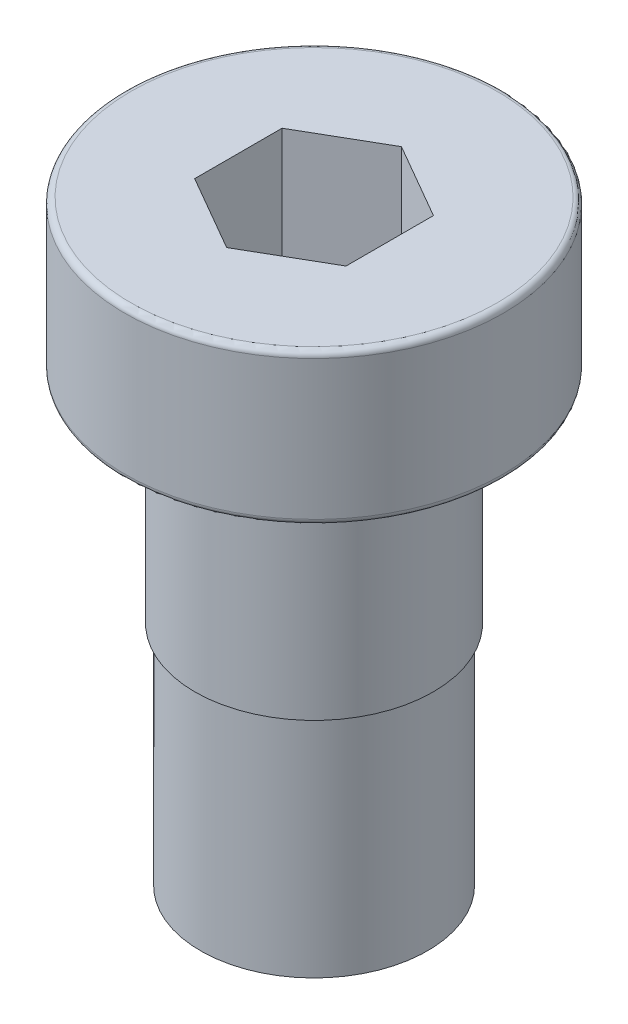
ISO-10303-21;
HEADER;
FILE_DESCRIPTION(('STEP AP214'),'2;1');
FILE_NAME('part.step','',(''),(''),'','','');
FILE_SCHEMA(('AUTOMOTIVE_DESIGN { 1 0 10303 214 1 1 1 1 }'));
ENDSEC;
DATA;
#1=APPLICATION_CONTEXT('core data for automotive mechanical design processes');
#2=APPLICATION_PROTOCOL_DEFINITION('international standard','automotive_design',2000,#1);
#3=PRODUCT_CONTEXT('',#1,'mechanical');
#4=PRODUCT('Part','Part','',(#3));
#5=PRODUCT_RELATED_PRODUCT_CATEGORY('part','',(#4));
#6=PRODUCT_DEFINITION_FORMATION('','',#4);
#7=PRODUCT_DEFINITION_CONTEXT('part definition',#1,'design');
#8=PRODUCT_DEFINITION('design','',#6,#7);
#9=PRODUCT_DEFINITION_SHAPE('','',#8);
#10=(LENGTH_UNIT() NAMED_UNIT(*) SI_UNIT(.MILLI.,.METRE.));
#11=(NAMED_UNIT(*) PLANE_ANGLE_UNIT() SI_UNIT($,.RADIAN.));
#12=(NAMED_UNIT(*) SI_UNIT($,.STERADIAN.) SOLID_ANGLE_UNIT());
#13=UNCERTAINTY_MEASURE_WITH_UNIT(LENGTH_MEASURE(1.E-05),#10,'distance_accuracy_value','');
#14=(GEOMETRIC_REPRESENTATION_CONTEXT(3) GLOBAL_UNCERTAINTY_ASSIGNED_CONTEXT((#13)) GLOBAL_UNIT_ASSIGNED_CONTEXT((#10,
#11,#12)) REPRESENTATION_CONTEXT('',''));
#15=CARTESIAN_POINT('',(0.,0.,0.));
#16=DIRECTION('',(0.,0.,1.));
#17=DIRECTION('',(1.,0.,0.));
#18=AXIS2_PLACEMENT_3D('',#15,#16,#17);
#19=CARTESIAN_POINT('',(0.,-16.6788453947775,0.));
#20=DIRECTION('',(0.,1.,0.));
#21=DIRECTION('',(-1.,0.,0.));
#22=AXIS2_PLACEMENT_3D('',#19,#20,#21);
#23=CYLINDRICAL_SURFACE('',#22,4.7625);
#24=CARTESIAN_POINT('',(0.,-4.56311,0.));
#25=DIRECTION('',(0.,1.,0.));
#26=DIRECTION('',(-1.,0.,0.));
#27=AXIS2_PLACEMENT_3D('',#24,#25,#26);
#28=CIRCLE('',#27,4.7625);
#29=CARTESIAN_POINT('',(-4.76249999999999,-4.56311,0.));
#30=VERTEX_POINT('',#29);
#31=EDGE_CURVE('E148',#30,#30,#28,.T.);
#32=ORIENTED_EDGE('',*,*,#31,.F.);
#33=EDGE_LOOP('',(#32));
#34=FACE_BOUND('',#33,.T.);
#35=CARTESIAN_POINT('',(0.,-14.08811,0.));
#36=DIRECTION('',(0.,1.,0.));
#37=DIRECTION('',(-1.,0.,0.));
#38=AXIS2_PLACEMENT_3D('',#35,#36,#37);
#39=CIRCLE('',#38,4.7625);
#40=CARTESIAN_POINT('',(-4.7625,-14.08811,0.));
#41=VERTEX_POINT('',#40);
#42=EDGE_CURVE('E137',#41,#41,#39,.T.);
#43=ORIENTED_EDGE('',*,*,#42,.T.);
#44=EDGE_LOOP('',(#43));
#45=FACE_BOUND('',#44,.T.);
#46=ADVANCED_FACE('F35',(#34,#45),#23,.T.);
#47=CARTESIAN_POINT('',(0.,-4.56311,0.));
#48=DIRECTION('',(0.,-1.,0.));
#49=DIRECTION('',(1.,0.,0.));
#50=AXIS2_PLACEMENT_3D('',#47,#48,#49);
#51=PLANE('',#50);
#52=ORIENTED_EDGE('',*,*,#31,.T.);
#53=EDGE_LOOP('',(#52));
#54=FACE_BOUND('',#53,.T.);
#55=CARTESIAN_POINT('',(0.,-4.56311,0.));
#56=DIRECTION('',(0.,1.,0.));
#57=DIRECTION('',(-1.,0.,0.));
#58=AXIS2_PLACEMENT_3D('',#55,#56,#57);
#59=CIRCLE('',#58,5.);
#60=CARTESIAN_POINT('',(-4.99999999999999,-4.56311,0.));
#61=VERTEX_POINT('',#60);
#62=EDGE_CURVE('E145',#61,#61,#59,.T.);
#63=ORIENTED_EDGE('',*,*,#62,.F.);
#64=EDGE_LOOP('',(#63));
#65=FACE_BOUND('',#64,.T.);
#66=ADVANCED_FACE('F198',(#54,#65),#51,.T.);
#67=CARTESIAN_POINT('',(0.,-16.6788453947775,0.));
#68=DIRECTION('',(0.,1.,0.));
#69=DIRECTION('',(-1.,0.,0.));
#70=AXIS2_PLACEMENT_3D('',#67,#68,#69);
#71=CYLINDRICAL_SURFACE('',#70,5.);
#72=CARTESIAN_POINT('',(0.,4.30911,0.));
#73=DIRECTION('',(0.,-1.,0.));
#74=DIRECTION('',(1.,0.,0.));
#75=AXIS2_PLACEMENT_3D('',#72,#73,#74);
#76=CIRCLE('',#75,5.);
#77=CARTESIAN_POINT('',(5.,4.30911,0.));
#78=VERTEX_POINT('',#77);
#79=EDGE_CURVE('E154',#78,#78,#76,.T.);
#80=ORIENTED_EDGE('',*,*,#79,.T.);
#81=EDGE_LOOP('',(#80));
#82=FACE_BOUND('',#81,.T.);
#83=ORIENTED_EDGE('',*,*,#62,.T.);
#84=EDGE_LOOP('',(#83));
#85=FACE_BOUND('',#84,.T.);
#86=ADVANCED_FACE('F204',(#82,#85),#71,.T.);
#87=CARTESIAN_POINT('',(0.,4.56311,0.));
#88=DIRECTION('',(0.,-1.,0.));
#89=DIRECTION('',(1.,0.,0.));
#90=AXIS2_PLACEMENT_3D('',#87,#88,#89);
#91=PLANE('',#90);
#92=CARTESIAN_POINT('',(0.,4.56311,0.));
#93=DIRECTION('',(0.,-1.,0.));
#94=DIRECTION('',(1.,0.,0.));
#95=AXIS2_PLACEMENT_3D('',#92,#93,#94);
#96=CIRCLE('',#95,7.68349999999999);
#97=CARTESIAN_POINT('',(7.6835,4.56311,0.));
#98=VERTEX_POINT('',#97);
#99=EDGE_CURVE('E11',#98,#98,#96,.T.);
#100=ORIENTED_EDGE('',*,*,#99,.T.);
#101=EDGE_LOOP('',(#100));
#102=FACE_BOUND('',#101,.T.);
#103=CARTESIAN_POINT('',(0.,4.56311,0.));
#104=DIRECTION('',(0.,-1.,0.));
#105=DIRECTION('',(1.,0.,0.));
#106=AXIS2_PLACEMENT_3D('',#103,#104,#105);
#107=CIRCLE('',#106,5.254);
#108=CARTESIAN_POINT('',(5.254,4.56311,0.));
#109=VERTEX_POINT('',#108);
#110=EDGE_CURVE('E151',#109,#109,#107,.F.);
#111=ORIENTED_EDGE('',*,*,#110,.T.);
#112=EDGE_LOOP('',(#111));
#113=FACE_BOUND('',#112,.T.);
#114=ADVANCED_FACE('F221',(#102,#113),#91,.T.);
#115=CARTESIAN_POINT('',(0.,-16.6788453947775,0.));
#116=DIRECTION('',(0.,1.,0.));
#117=DIRECTION('',(-1.,0.,0.));
#118=AXIS2_PLACEMENT_3D('',#115,#116,#117);
#119=CYLINDRICAL_SURFACE('',#118,7.93749999999999);
#120=CARTESIAN_POINT('',(0.,10.65911,0.));
#121=DIRECTION('',(0.,-1.,0.));
#122=DIRECTION('',(1.,0.,0.));
#123=AXIS2_PLACEMENT_3D('',#120,#121,#122);
#124=CIRCLE('',#123,7.93749999999999);
#125=CARTESIAN_POINT('',(7.9375,10.65911,0.));
#126=VERTEX_POINT('',#125);
#127=EDGE_CURVE('E43',#126,#126,#124,.T.);
#128=ORIENTED_EDGE('',*,*,#127,.T.);
#129=EDGE_LOOP('',(#128));
#130=FACE_BOUND('',#129,.T.);
#131=CARTESIAN_POINT('',(0.,4.81711,0.));
#132=DIRECTION('',(0.,-1.,0.));
#133=DIRECTION('',(1.,0.,0.));
#134=AXIS2_PLACEMENT_3D('',#131,#132,#133);
#135=CIRCLE('',#134,7.93749999999999);
#136=CARTESIAN_POINT('',(7.9375,4.81710999999999,0.));
#137=VERTEX_POINT('',#136);
#138=EDGE_CURVE('E160',#137,#137,#135,.F.);
#139=ORIENTED_EDGE('',*,*,#138,.T.);
#140=EDGE_LOOP('',(#139));
#141=FACE_BOUND('',#140,.T.);
#142=ADVANCED_FACE('F165',(#130,#141),#119,.T.);
#143=CARTESIAN_POINT('',(0.,10.91311,0.));
#144=DIRECTION('',(0.,-1.,0.));
#145=DIRECTION('',(1.,0.,0.));
#146=AXIS2_PLACEMENT_3D('',#143,#144,#145);
#147=PLANE('',#146);
#148=CARTESIAN_POINT('',(0.,10.91311,0.));
#149=DIRECTION('',(0.,-1.,0.));
#150=DIRECTION('',(1.,0.,0.));
#151=AXIS2_PLACEMENT_3D('',#148,#149,#150);
#152=CIRCLE('',#151,7.68349999999999);
#153=CARTESIAN_POINT('',(7.6835,10.91311,0.));
#154=VERTEX_POINT('',#153);
#155=EDGE_CURVE('E157',#154,#154,#152,.F.);
#156=ORIENTED_EDGE('',*,*,#155,.T.);
#157=EDGE_LOOP('',(#156));
#158=FACE_BOUND('',#157,.T.);
#159=DIRECTION('',(-0.866025403784439,0.,0.5));
#160=VECTOR('',#159,1.);
#161=CARTESIAN_POINT('',(0.,10.91311,-3.66617420935412));
#162=LINE('',#161,#160);
#163=CARTESIAN_POINT('',(0.,10.91311,-3.66617420935412));
#164=VERTEX_POINT('',#163);
#165=CARTESIAN_POINT('',(-3.175,10.91311,-1.83308710467706));
#166=VERTEX_POINT('',#165);
#167=EDGE_CURVE('E124',#164,#166,#162,.T.);
#168=ORIENTED_EDGE('',*,*,#167,.F.);
#169=DIRECTION('',(-0.866025403784439,0.,-0.5));
#170=VECTOR('',#169,1.);
#171=CARTESIAN_POINT('',(3.175,10.91311,-1.83308710467706));
#172=LINE('',#171,#170);
#173=CARTESIAN_POINT('',(3.175,10.91311,-1.83308710467706));
#174=VERTEX_POINT('',#173);
#175=EDGE_CURVE('E50',#174,#164,#172,.T.);
#176=ORIENTED_EDGE('',*,*,#175,.F.);
#177=DIRECTION('',(0.,0.,-1.));
#178=VECTOR('',#177,1.);
#179=CARTESIAN_POINT('',(3.175,10.91311,1.83308710467706));
#180=LINE('',#179,#178);
#181=CARTESIAN_POINT('',(3.175,10.91311,1.83308710467706));
#182=VERTEX_POINT('',#181);
#183=EDGE_CURVE('E133',#182,#174,#180,.T.);
#184=ORIENTED_EDGE('',*,*,#183,.F.);
#185=DIRECTION('',(0.866025403784439,0.,-0.5));
#186=VECTOR('',#185,1.);
#187=CARTESIAN_POINT('',(0.,10.91311,3.66617420935412));
#188=LINE('',#187,#186);
#189=CARTESIAN_POINT('',(0.,10.91311,3.66617420935412));
#190=VERTEX_POINT('',#189);
#191=EDGE_CURVE('E131',#190,#182,#188,.T.);
#192=ORIENTED_EDGE('',*,*,#191,.F.);
#193=DIRECTION('',(0.866025403784438,0.,0.5));
#194=VECTOR('',#193,1.);
#195=CARTESIAN_POINT('',(-3.175,10.91311,1.83308710467706));
#196=LINE('',#195,#194);
#197=CARTESIAN_POINT('',(-3.175,10.91311,1.83308710467706));
#198=VERTEX_POINT('',#197);
#199=EDGE_CURVE('E98',#198,#190,#196,.T.);
#200=ORIENTED_EDGE('',*,*,#199,.F.);
#201=DIRECTION('',(0.,0.,1.));
#202=VECTOR('',#201,1.);
#203=CARTESIAN_POINT('',(-3.175,10.91311,-1.83308710467706));
#204=LINE('',#203,#202);
#205=EDGE_CURVE('E127',#166,#198,#204,.T.);
#206=ORIENTED_EDGE('',*,*,#205,.F.);
#207=EDGE_LOOP('',(#168,#176,#184,#192,#200,#206));
#208=FACE_BOUND('',#207,.T.);
#209=ADVANCED_FACE('F174',(#158,#208),#147,.F.);
#210=CARTESIAN_POINT('',(0.,-14.08811,0.));
#211=DIRECTION('',(0.,1.,0.));
#212=DIRECTION('',(-1.,0.,0.));
#213=AXIS2_PLACEMENT_3D('',#210,#211,#212);
#214=PLANE('',#213);
#215=ORIENTED_EDGE('',*,*,#42,.F.);
#216=EDGE_LOOP('',(#215));
#217=FACE_BOUND('',#216,.T.);
#218=ADVANCED_FACE('F177',(#217),#214,.F.);
#219=CARTESIAN_POINT('',(3.175,4.56311000000001,-1.83308710467706));
#220=DIRECTION('',(0.5,0.,-0.866025403784439));
#221=DIRECTION('',(-0.866025403784439,0.,-0.5));
#222=AXIS2_PLACEMENT_3D('',#219,#220,#221);
#223=PLANE('',#222);
#224=ORIENTED_EDGE('',*,*,#175,.T.);
#225=DIRECTION('',(0.,1.,0.));
#226=VECTOR('',#225,1.);
#227=CARTESIAN_POINT('',(0.,4.56311000000001,-3.66617420935412));
#228=LINE('',#227,#226);
#229=CARTESIAN_POINT('',(0.,4.56311000000001,-3.66617420935412));
#230=VERTEX_POINT('',#229);
#231=EDGE_CURVE('E80',#230,#164,#228,.T.);
#232=ORIENTED_EDGE('',*,*,#231,.F.);
#233=DIRECTION('',(-0.866025403784439,0.,-0.5));
#234=VECTOR('',#233,1.);
#235=CARTESIAN_POINT('',(3.175,4.56311000000001,-1.83308710467706));
#236=LINE('',#235,#234);
#237=CARTESIAN_POINT('',(3.175,4.56311000000001,-1.83308710467706));
#238=VERTEX_POINT('',#237);
#239=EDGE_CURVE('E135',#238,#230,#236,.T.);
#240=ORIENTED_EDGE('',*,*,#239,.F.);
#241=DIRECTION('',(0.,1.,0.));
#242=VECTOR('',#241,1.);
#243=CARTESIAN_POINT('',(3.175,4.56311000000001,-1.83308710467706));
#244=LINE('',#243,#242);
#245=EDGE_CURVE('E58',#238,#174,#244,.T.);
#246=ORIENTED_EDGE('',*,*,#245,.T.);
#247=EDGE_LOOP('',(#224,#232,#240,#246));
#248=FACE_BOUND('',#247,.T.);
#249=ADVANCED_FACE('F185',(#248),#223,.F.);
#250=CARTESIAN_POINT('',(3.175,4.56311000000001,1.83308710467706));
#251=DIRECTION('',(1.,0.,0.));
#252=DIRECTION('',(0.,1.,0.));
#253=AXIS2_PLACEMENT_3D('',#250,#251,#252);
#254=PLANE('',#253);
#255=ORIENTED_EDGE('',*,*,#183,.T.);
#256=ORIENTED_EDGE('',*,*,#245,.F.);
#257=DIRECTION('',(0.,0.,-1.));
#258=VECTOR('',#257,1.);
#259=CARTESIAN_POINT('',(3.175,4.56311000000001,1.83308710467706));
#260=LINE('',#259,#258);
#261=CARTESIAN_POINT('',(3.175,4.56311000000001,1.83308710467706));
#262=VERTEX_POINT('',#261);
#263=EDGE_CURVE('E110',#262,#238,#260,.T.);
#264=ORIENTED_EDGE('',*,*,#263,.F.);
#265=DIRECTION('',(0.,1.,0.));
#266=VECTOR('',#265,1.);
#267=CARTESIAN_POINT('',(3.175,4.56311000000001,1.83308710467706));
#268=LINE('',#267,#266);
#269=EDGE_CURVE('E102',#262,#182,#268,.T.);
#270=ORIENTED_EDGE('',*,*,#269,.T.);
#271=EDGE_LOOP('',(#255,#256,#264,#270));
#272=FACE_BOUND('',#271,.T.);
#273=ADVANCED_FACE('F187',(#272),#254,.F.);
#274=CARTESIAN_POINT('',(0.,4.56311000000001,3.66617420935412));
#275=DIRECTION('',(0.5,0.,0.866025403784439));
#276=DIRECTION('',(0.866025403784439,0.,-0.5));
#277=AXIS2_PLACEMENT_3D('',#274,#275,#276);
#278=PLANE('',#277);
#279=ORIENTED_EDGE('',*,*,#191,.T.);
#280=ORIENTED_EDGE('',*,*,#269,.F.);
#281=DIRECTION('',(0.866025403784439,0.,-0.5));
#282=VECTOR('',#281,1.);
#283=CARTESIAN_POINT('',(0.,4.56311000000001,3.66617420935412));
#284=LINE('',#283,#282);
#285=CARTESIAN_POINT('',(0.,4.56311000000001,3.66617420935412));
#286=VERTEX_POINT('',#285);
#287=EDGE_CURVE('E106',#286,#262,#284,.T.);
#288=ORIENTED_EDGE('',*,*,#287,.F.);
#289=DIRECTION('',(0.,1.,0.));
#290=VECTOR('',#289,1.);
#291=CARTESIAN_POINT('',(0.,4.56311000000001,3.66617420935412));
#292=LINE('',#291,#290);
#293=EDGE_CURVE('E91',#286,#190,#292,.T.);
#294=ORIENTED_EDGE('',*,*,#293,.T.);
#295=EDGE_LOOP('',(#279,#280,#288,#294));
#296=FACE_BOUND('',#295,.T.);
#297=ADVANCED_FACE('F107',(#296),#278,.F.);
#298=CARTESIAN_POINT('',(-3.175,4.56311000000001,1.83308710467706));
#299=DIRECTION('',(-0.5,0.,0.866025403784438));
#300=DIRECTION('',(0.866025403784439,0.,0.5));
#301=AXIS2_PLACEMENT_3D('',#298,#299,#300);
#302=PLANE('',#301);
#303=ORIENTED_EDGE('',*,*,#199,.T.);
#304=ORIENTED_EDGE('',*,*,#293,.F.);
#305=DIRECTION('',(0.866025403784438,0.,0.5));
#306=VECTOR('',#305,1.);
#307=CARTESIAN_POINT('',(-3.175,4.56311000000001,1.83308710467706));
#308=LINE('',#307,#306);
#309=CARTESIAN_POINT('',(-3.175,4.56311000000001,1.83308710467706));
#310=VERTEX_POINT('',#309);
#311=EDGE_CURVE('E95',#310,#286,#308,.T.);
#312=ORIENTED_EDGE('',*,*,#311,.F.);
#313=DIRECTION('',(0.,1.,0.));
#314=VECTOR('',#313,1.);
#315=CARTESIAN_POINT('',(-3.175,4.56311000000001,1.83308710467706));
#316=LINE('',#315,#314);
#317=EDGE_CURVE('E103',#310,#198,#316,.T.);
#318=ORIENTED_EDGE('',*,*,#317,.T.);
#319=EDGE_LOOP('',(#303,#304,#312,#318));
#320=FACE_BOUND('',#319,.T.);
#321=ADVANCED_FACE('F93',(#320),#302,.F.);
#322=CARTESIAN_POINT('',(-3.175,4.56311000000001,-1.83308710467706));
#323=DIRECTION('',(-1.,0.,0.));
#324=DIRECTION('',(0.,-1.,0.));
#325=AXIS2_PLACEMENT_3D('',#322,#323,#324);
#326=PLANE('',#325);
#327=ORIENTED_EDGE('',*,*,#205,.T.);
#328=ORIENTED_EDGE('',*,*,#317,.F.);
#329=DIRECTION('',(0.,0.,1.));
#330=VECTOR('',#329,1.);
#331=CARTESIAN_POINT('',(-3.175,4.56311000000001,-1.83308710467706));
#332=LINE('',#331,#330);
#333=CARTESIAN_POINT('',(-3.175,4.56311000000001,-1.83308710467706));
#334=VERTEX_POINT('',#333);
#335=EDGE_CURVE('E116',#334,#310,#332,.T.);
#336=ORIENTED_EDGE('',*,*,#335,.F.);
#337=DIRECTION('',(0.,1.,0.));
#338=VECTOR('',#337,1.);
#339=CARTESIAN_POINT('',(-3.175,4.56311000000001,-1.83308710467706));
#340=LINE('',#339,#338);
#341=EDGE_CURVE('E140',#334,#166,#340,.T.);
#342=ORIENTED_EDGE('',*,*,#341,.T.);
#343=EDGE_LOOP('',(#327,#328,#336,#342));
#344=FACE_BOUND('',#343,.T.);
#345=ADVANCED_FACE('F286',(#344),#326,.F.);
#346=CARTESIAN_POINT('',(0.,4.56311000000001,-3.66617420935412));
#347=DIRECTION('',(-0.5,0.,-0.866025403784439));
#348=DIRECTION('',(-0.866025403784439,0.,0.5));
#349=AXIS2_PLACEMENT_3D('',#346,#347,#348);
#350=PLANE('',#349);
#351=ORIENTED_EDGE('',*,*,#167,.T.);
#352=ORIENTED_EDGE('',*,*,#341,.F.);
#353=DIRECTION('',(-0.866025403784439,0.,0.5));
#354=VECTOR('',#353,1.);
#355=CARTESIAN_POINT('',(0.,4.56311000000001,-3.66617420935412));
#356=LINE('',#355,#354);
#357=EDGE_CURVE('E118',#230,#334,#356,.T.);
#358=ORIENTED_EDGE('',*,*,#357,.F.);
#359=ORIENTED_EDGE('',*,*,#231,.T.);
#360=EDGE_LOOP('',(#351,#352,#358,#359));
#361=FACE_BOUND('',#360,.T.);
#362=ADVANCED_FACE('F183',(#361),#350,.F.);
#363=CARTESIAN_POINT('',(0.,4.56311000000001,0.));
#364=DIRECTION('',(0.,1.,0.));
#365=DIRECTION('',(0.,0.,1.));
#366=AXIS2_PLACEMENT_3D('',#363,#364,#365);
#367=PLANE('',#366);
#368=ORIENTED_EDGE('',*,*,#239,.T.);
#369=ORIENTED_EDGE('',*,*,#357,.T.);
#370=ORIENTED_EDGE('',*,*,#335,.T.);
#371=ORIENTED_EDGE('',*,*,#311,.T.);
#372=ORIENTED_EDGE('',*,*,#287,.T.);
#373=ORIENTED_EDGE('',*,*,#263,.T.);
#374=EDGE_LOOP('',(#368,#369,#370,#371,#372,#373));
#375=FACE_BOUND('',#374,.T.);
#376=ADVANCED_FACE('F113',(#375),#367,.T.);
#377=CARTESIAN_POINT('',(0.,4.30911,0.));
#378=DIRECTION('',(0.,-1.,0.));
#379=DIRECTION('',(1.,0.,0.));
#380=AXIS2_PLACEMENT_3D('',#377,#378,#379);
#381=TOROIDAL_SURFACE('',#380,5.254,0.254);
#382=ORIENTED_EDGE('',*,*,#79,.F.);
#383=EDGE_LOOP('',(#382));
#384=FACE_BOUND('',#383,.T.);
#385=ORIENTED_EDGE('',*,*,#110,.F.);
#386=EDGE_LOOP('',(#385));
#387=FACE_BOUND('',#386,.T.);
#388=ADVANCED_FACE('F171',(#384,#387),#381,.F.);
#389=CARTESIAN_POINT('',(0.,10.65911,0.));
#390=DIRECTION('',(0.,-1.,0.));
#391=DIRECTION('',(1.,0.,0.));
#392=AXIS2_PLACEMENT_3D('',#389,#390,#391);
#393=TOROIDAL_SURFACE('',#392,7.68349999999999,0.254);
#394=ORIENTED_EDGE('',*,*,#127,.F.);
#395=EDGE_LOOP('',(#394));
#396=FACE_BOUND('',#395,.T.);
#397=ORIENTED_EDGE('',*,*,#155,.F.);
#398=EDGE_LOOP('',(#397));
#399=FACE_BOUND('',#398,.T.);
#400=ADVANCED_FACE('F168',(#396,#399),#393,.T.);
#401=CARTESIAN_POINT('',(0.,4.81711,0.));
#402=DIRECTION('',(0.,-1.,0.));
#403=DIRECTION('',(1.,0.,0.));
#404=AXIS2_PLACEMENT_3D('',#401,#402,#403);
#405=TOROIDAL_SURFACE('',#404,7.68349999999999,0.254);
#406=ORIENTED_EDGE('',*,*,#99,.F.);
#407=EDGE_LOOP('',(#406));
#408=FACE_BOUND('',#407,.T.);
#409=ORIENTED_EDGE('',*,*,#138,.F.);
#410=EDGE_LOOP('',(#409));
#411=FACE_BOUND('',#410,.T.);
#412=ADVANCED_FACE('F37',(#408,#411),#405,.T.);
#413=CLOSED_SHELL('',(#46,#66,#86,#114,#142,#209,#218,#249,#273,#297,#321,#345,#362,#376,#388,
#400,#412));
#414=MANIFOLD_SOLID_BREP('B2',#413);
#415=ADVANCED_BREP_SHAPE_REPRESENTATION('',(#18,#414),#14);
#416=SHAPE_DEFINITION_REPRESENTATION(#9,#415);
ENDSEC;
END-ISO-10303-21;
